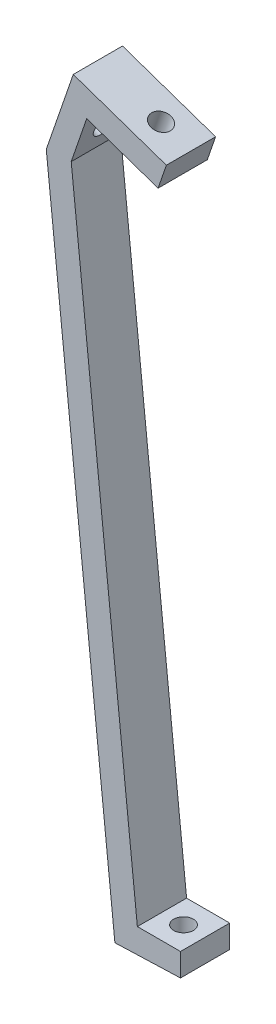
ISO-10303-21;
HEADER;
FILE_DESCRIPTION(('STEP AP214'),'2;1');
FILE_NAME('part.step','',(''),(''),'','','');
FILE_SCHEMA(('AUTOMOTIVE_DESIGN { 1 0 10303 214 1 1 1 1 }'));
ENDSEC;
DATA;
#1=APPLICATION_CONTEXT('core data for automotive mechanical design processes');
#2=APPLICATION_PROTOCOL_DEFINITION('international standard','automotive_design',2000,#1);
#3=PRODUCT_CONTEXT('',#1,'mechanical');
#4=PRODUCT('Part','Part','',(#3));
#5=PRODUCT_RELATED_PRODUCT_CATEGORY('part','',(#4));
#6=PRODUCT_DEFINITION_FORMATION('','',#4);
#7=PRODUCT_DEFINITION_CONTEXT('part definition',#1,'design');
#8=PRODUCT_DEFINITION('design','',#6,#7);
#9=PRODUCT_DEFINITION_SHAPE('','',#8);
#10=(LENGTH_UNIT() NAMED_UNIT(*) SI_UNIT(.MILLI.,.METRE.));
#11=(NAMED_UNIT(*) PLANE_ANGLE_UNIT() SI_UNIT($,.RADIAN.));
#12=(NAMED_UNIT(*) SI_UNIT($,.STERADIAN.) SOLID_ANGLE_UNIT());
#13=UNCERTAINTY_MEASURE_WITH_UNIT(LENGTH_MEASURE(1.E-05),#10,'distance_accuracy_value','');
#14=(GEOMETRIC_REPRESENTATION_CONTEXT(3) GLOBAL_UNCERTAINTY_ASSIGNED_CONTEXT((#13)) GLOBAL_UNIT_ASSIGNED_CONTEXT((#10,
#11,#12)) REPRESENTATION_CONTEXT('',''));
#15=CARTESIAN_POINT('',(0.,0.,0.));
#16=DIRECTION('',(0.,0.,1.));
#17=DIRECTION('',(1.,0.,0.));
#18=AXIS2_PLACEMENT_3D('',#15,#16,#17);
#19=CARTESIAN_POINT('',(39.2491732885539,87.5121632175011,3.));
#20=DIRECTION('',(0.945518575599317,-0.325568154457155,0.));
#21=DIRECTION('',(0.325568154457155,0.945518575599317,0.));
#22=AXIS2_PLACEMENT_3D('',#19,#20,#21);
#23=PLANE('',#22);
#24=CARTESIAN_POINT('',(38.3050256406282,84.7701593482631,0.));
#25=DIRECTION('',(0.945518575599317,-0.325568154457155,0.));
#26=DIRECTION('',(0.325568154457155,0.945518575599317,0.));
#27=AXIS2_PLACEMENT_3D('',#24,#25,#26);
#28=CIRCLE('',#27,1.2);
#29=CARTESIAN_POINT('',(38.6957074259767,85.9047816389823,0.));
#30=VERTEX_POINT('',#29);
#31=EDGE_CURVE('E137',#30,#30,#28,.T.);
#32=ORIENTED_EDGE('',*,*,#31,.F.);
#33=EDGE_LOOP('',(#32));
#34=FACE_BOUND('',#33,.T.);
#35=DIRECTION('',(-0.325568154457155,-0.945518575599317,0.));
#36=VECTOR('',#35,1.);
#37=CARTESIAN_POINT('',(39.2491732885539,87.5121632175011,-3.));
#38=LINE('',#37,#36);
#39=CARTESIAN_POINT('',(39.2491732885539,87.5121632175011,-3.));
#40=VERTEX_POINT('',#39);
#41=CARTESIAN_POINT('',(37.3608779927024,82.0281554790251,-3.));
#42=VERTEX_POINT('',#41);
#43=EDGE_CURVE('E134',#40,#42,#38,.T.);
#44=ORIENTED_EDGE('',*,*,#43,.F.);
#45=DIRECTION('',(0.,0.,-1.));
#46=VECTOR('',#45,1.);
#47=CARTESIAN_POINT('',(39.2491732885539,87.5121632175011,3.));
#48=LINE('',#47,#46);
#49=CARTESIAN_POINT('',(39.2491732885539,87.5121632175011,3.));
#50=VERTEX_POINT('',#49);
#51=EDGE_CURVE('E11',#50,#40,#48,.T.);
#52=ORIENTED_EDGE('',*,*,#51,.F.);
#53=DIRECTION('',(-0.325568154457155,-0.945518575599317,0.));
#54=VECTOR('',#53,1.);
#55=CARTESIAN_POINT('',(39.2491732885539,87.5121632175011,3.));
#56=LINE('',#55,#54);
#57=CARTESIAN_POINT('',(37.3608779927024,82.0281554790251,3.));
#58=VERTEX_POINT('',#57);
#59=EDGE_CURVE('E150',#50,#58,#56,.T.);
#60=ORIENTED_EDGE('',*,*,#59,.T.);
#61=DIRECTION('',(0.,0.,-1.));
#62=VECTOR('',#61,1.);
#63=CARTESIAN_POINT('',(37.3608779927024,82.0281554790251,3.));
#64=LINE('',#63,#62);
#65=EDGE_CURVE('E36',#58,#42,#64,.T.);
#66=ORIENTED_EDGE('',*,*,#65,.T.);
#67=EDGE_LOOP('',(#44,#52,#60,#66));
#68=FACE_BOUND('',#67,.T.);
#69=ADVANCED_FACE('F33',(#34,#68),#23,.T.);
#70=CARTESIAN_POINT('',(34.3227441956758,81.8051240207859,3.));
#71=DIRECTION('',(-0.945518575599318,0.325568154457153,0.));
#72=DIRECTION('',(-0.325568154457153,-0.945518575599318,0.));
#73=AXIS2_PLACEMENT_3D('',#70,#71,#72);
#74=PLANE('',#73);
#75=CARTESIAN_POINT('',(35.6575736289501,85.6817501807431,0.));
#76=DIRECTION('',(-0.945518575599318,0.325568154457153,0.));
#77=DIRECTION('',(-0.325568154457153,-0.945518575599318,0.));
#78=AXIS2_PLACEMENT_3D('',#75,#76,#77);
#79=CIRCLE('',#78,1.2);
#80=CARTESIAN_POINT('',(35.2668918436015,84.5471278900239,0.));
#81=VERTEX_POINT('',#80);
#82=EDGE_CURVE('E189',#81,#81,#79,.F.);
#83=ORIENTED_EDGE('',*,*,#82,.T.);
#84=EDGE_LOOP('',(#83));
#85=FACE_BOUND('',#84,.T.);
#86=DIRECTION('',(0.325568154457153,0.945518575599318,0.));
#87=VECTOR('',#86,1.);
#88=CARTESIAN_POINT('',(34.3227441956758,81.8051240207859,-3.));
#89=LINE('',#88,#87);
#90=CARTESIAN_POINT('',(34.3227441956758,81.8051240207859,-3.));
#91=VERTEX_POINT('',#90);
#92=CARTESIAN_POINT('',(37.610982555693,91.354861634339,-3.));
#93=VERTEX_POINT('',#92);
#94=EDGE_CURVE('E148',#91,#93,#89,.T.);
#95=ORIENTED_EDGE('',*,*,#94,.F.);
#96=DIRECTION('',(0.,0.,-1.));
#97=VECTOR('',#96,1.);
#98=CARTESIAN_POINT('',(34.3227441956758,81.8051240207859,3.));
#99=LINE('',#98,#97);
#100=CARTESIAN_POINT('',(34.3227441956758,81.8051240207859,3.));
#101=VERTEX_POINT('',#100);
#102=EDGE_CURVE('E42',#101,#91,#99,.T.);
#103=ORIENTED_EDGE('',*,*,#102,.F.);
#104=DIRECTION('',(0.325568154457153,0.945518575599318,0.));
#105=VECTOR('',#104,1.);
#106=CARTESIAN_POINT('',(34.3227441956758,81.8051240207859,3.));
#107=LINE('',#106,#105);
#108=CARTESIAN_POINT('',(37.610982555693,91.354861634339,3.));
#109=VERTEX_POINT('',#108);
#110=EDGE_CURVE('E132',#101,#109,#107,.T.);
#111=ORIENTED_EDGE('',*,*,#110,.T.);
#112=DIRECTION('',(0.,0.,1.));
#113=VECTOR('',#112,1.);
#114=CARTESIAN_POINT('',(37.610982555693,91.354861634339,-3.));
#115=LINE('',#114,#113);
#116=EDGE_CURVE('E204',#93,#109,#115,.T.);
#117=ORIENTED_EDGE('',*,*,#116,.F.);
#118=EDGE_LOOP('',(#95,#103,#111,#117));
#119=FACE_BOUND('',#118,.T.);
#120=ADVANCED_FACE('F177',(#85,#119),#74,.T.);
#121=CARTESIAN_POINT('',(34.3227441956758,81.8051240207859,3.));
#122=DIRECTION('',(0.994521895368273,0.104528463267658,0.));
#123=DIRECTION('',(-0.104528463267658,0.994521895368273,0.));
#124=AXIS2_PLACEMENT_3D('',#121,#122,#123);
#125=PLANE('',#124);
#126=DIRECTION('',(0.104528463267658,-0.994521895368273,0.));
#127=VECTOR('',#126,1.);
#128=CARTESIAN_POINT('',(34.3227441956758,81.8051240207859,-3.));
#129=LINE('',#128,#127);
#130=CARTESIAN_POINT('',(42.6850212570884,2.24337239132408,-3.));
#131=VERTEX_POINT('',#130);
#132=EDGE_CURVE('E146',#91,#131,#129,.T.);
#133=ORIENTED_EDGE('',*,*,#132,.T.);
#134=DIRECTION('',(0.,0.,-1.));
#135=VECTOR('',#134,1.);
#136=CARTESIAN_POINT('',(42.6850212570884,2.24337239132408,3.));
#137=LINE('',#136,#135);
#138=CARTESIAN_POINT('',(42.6850212570884,2.24337239132408,3.));
#139=VERTEX_POINT('',#138);
#140=EDGE_CURVE('E119',#139,#131,#137,.T.);
#141=ORIENTED_EDGE('',*,*,#140,.F.);
#142=DIRECTION('',(0.104528463267658,-0.994521895368273,0.));
#143=VECTOR('',#142,1.);
#144=CARTESIAN_POINT('',(34.3227441956758,81.8051240207859,3.));
#145=LINE('',#144,#143);
#146=EDGE_CURVE('E107',#101,#139,#145,.T.);
#147=ORIENTED_EDGE('',*,*,#146,.F.);
#148=ORIENTED_EDGE('',*,*,#102,.T.);
#149=EDGE_LOOP('',(#133,#141,#147,#148));
#150=FACE_BOUND('',#149,.T.);
#151=ADVANCED_FACE('F184',(#150),#125,.F.);
#152=CARTESIAN_POINT('',(42.6850212570884,2.24337239132408,3.));
#153=DIRECTION('',(-0.0348994967025016,0.999390827019096,0.));
#154=DIRECTION('',(-0.999390827019096,-0.0348994967025016,0.));
#155=AXIS2_PLACEMENT_3D('',#152,#153,#154);
#156=PLANE('',#155);
#157=CARTESIAN_POINT('',(48.0515539700871,2.43077584316464,0.));
#158=DIRECTION('',(-0.0348994967025016,0.999390827019096,0.));
#159=DIRECTION('',(0.999390827019096,0.0348994967025016,0.));
#160=AXIS2_PLACEMENT_3D('',#157,#158,#159);
#161=ELLIPSE('',#160,1.20073145315859,1.2);
#162=CARTESIAN_POINT('',(49.2515539700871,2.47268076655473,0.));
#163=VERTEX_POINT('',#162);
#164=EDGE_CURVE('E192',#163,#163,#161,.F.);
#165=ORIENTED_EDGE('',*,*,#164,.F.);
#166=EDGE_LOOP('',(#165));
#167=FACE_BOUND('',#166,.T.);
#168=DIRECTION('',(0.999390827019096,0.0348994967025016,0.));
#169=VECTOR('',#168,1.);
#170=CARTESIAN_POINT('',(42.6850212570884,2.24337239132408,-3.));
#171=LINE('',#170,#169);
#172=CARTESIAN_POINT('',(50.6801478732412,2.52256836494409,-3.));
#173=VERTEX_POINT('',#172);
#174=EDGE_CURVE('E116',#131,#173,#171,.T.);
#175=ORIENTED_EDGE('',*,*,#174,.T.);
#176=DIRECTION('',(0.,0.,-1.));
#177=VECTOR('',#176,1.);
#178=CARTESIAN_POINT('',(50.6801478732412,2.52256836494409,3.));
#179=LINE('',#178,#177);
#180=CARTESIAN_POINT('',(50.6801478732412,2.52256836494409,3.));
#181=VERTEX_POINT('',#180);
#182=EDGE_CURVE('E113',#181,#173,#179,.T.);
#183=ORIENTED_EDGE('',*,*,#182,.F.);
#184=DIRECTION('',(0.999390827019096,0.0348994967025016,0.));
#185=VECTOR('',#184,1.);
#186=CARTESIAN_POINT('',(42.6850212570884,2.24337239132408,3.));
#187=LINE('',#186,#185);
#188=EDGE_CURVE('E99',#139,#181,#187,.T.);
#189=ORIENTED_EDGE('',*,*,#188,.F.);
#190=ORIENTED_EDGE('',*,*,#140,.T.);
#191=EDGE_LOOP('',(#175,#183,#189,#190));
#192=FACE_BOUND('',#191,.T.);
#193=ADVANCED_FACE('F114',(#167,#192),#156,.F.);
#194=CARTESIAN_POINT('',(50.6801478732412,2.52256836494409,3.));
#195=DIRECTION('',(-1.,0.,0.));
#196=DIRECTION('',(0.,0.,1.));
#197=AXIS2_PLACEMENT_3D('',#194,#195,#196);
#198=PLANE('',#197);
#199=DIRECTION('',(0.,1.,0.));
#200=VECTOR('',#199,1.);
#201=CARTESIAN_POINT('',(50.6801478732412,2.52256836494409,-3.));
#202=LINE('',#201,#200);
#203=CARTESIAN_POINT('',(50.6801478732412,5.32256836494409,-3.));
#204=VERTEX_POINT('',#203);
#205=EDGE_CURVE('E143',#173,#204,#202,.T.);
#206=ORIENTED_EDGE('',*,*,#205,.T.);
#207=DIRECTION('',(0.,0.,-1.));
#208=VECTOR('',#207,1.);
#209=CARTESIAN_POINT('',(50.6801478732412,5.32256836494409,3.));
#210=LINE('',#209,#208);
#211=CARTESIAN_POINT('',(50.6801478732412,5.32256836494409,3.));
#212=VERTEX_POINT('',#211);
#213=EDGE_CURVE('E120',#212,#204,#210,.T.);
#214=ORIENTED_EDGE('',*,*,#213,.F.);
#215=DIRECTION('',(0.,1.,0.));
#216=VECTOR('',#215,1.);
#217=CARTESIAN_POINT('',(50.6801478732412,2.52256836494409,3.));
#218=LINE('',#217,#216);
#219=EDGE_CURVE('E104',#181,#212,#218,.T.);
#220=ORIENTED_EDGE('',*,*,#219,.F.);
#221=ORIENTED_EDGE('',*,*,#182,.T.);
#222=EDGE_LOOP('',(#206,#214,#220,#221));
#223=FACE_BOUND('',#222,.T.);
#224=ADVANCED_FACE('F122',(#223),#198,.F.);
#225=CARTESIAN_POINT('',(50.6801478732412,5.32256836494409,3.));
#226=DIRECTION('',(0.,-1.,0.));
#227=DIRECTION('',(0.,0.,-1.));
#228=AXIS2_PLACEMENT_3D('',#225,#226,#227);
#229=PLANE('',#228);
#230=CARTESIAN_POINT('',(48.0515539700871,5.3225683649441,0.));
#231=DIRECTION('',(0.,1.,0.));
#232=DIRECTION('',(-1.,0.,0.));
#233=AXIS2_PLACEMENT_3D('',#230,#231,#232);
#234=CIRCLE('',#233,1.2);
#235=CARTESIAN_POINT('',(46.8515539700871,5.3225683649441,0.));
#236=VERTEX_POINT('',#235);
#237=EDGE_CURVE('E212',#236,#236,#234,.T.);
#238=ORIENTED_EDGE('',*,*,#237,.F.);
#239=EDGE_LOOP('',(#238));
#240=FACE_BOUND('',#239,.T.);
#241=DIRECTION('',(-1.,0.,0.));
#242=VECTOR('',#241,1.);
#243=CARTESIAN_POINT('',(50.6801478732412,5.32256836494409,-3.));
#244=LINE('',#243,#242);
#245=CARTESIAN_POINT('',(45.422960066933,5.32256836494409,-3.));
#246=VERTEX_POINT('',#245);
#247=EDGE_CURVE('E140',#204,#246,#244,.T.);
#248=ORIENTED_EDGE('',*,*,#247,.T.);
#249=DIRECTION('',(0.,0.,-1.));
#250=VECTOR('',#249,1.);
#251=CARTESIAN_POINT('',(45.422960066933,5.32256836494409,3.));
#252=LINE('',#251,#250);
#253=CARTESIAN_POINT('',(45.422960066933,5.32256836494409,3.));
#254=VERTEX_POINT('',#253);
#255=EDGE_CURVE('E154',#254,#246,#252,.T.);
#256=ORIENTED_EDGE('',*,*,#255,.F.);
#257=DIRECTION('',(-1.,0.,0.));
#258=VECTOR('',#257,1.);
#259=CARTESIAN_POINT('',(50.6801478732412,5.32256836494409,3.));
#260=LINE('',#259,#258);
#261=EDGE_CURVE('E125',#212,#254,#260,.T.);
#262=ORIENTED_EDGE('',*,*,#261,.F.);
#263=ORIENTED_EDGE('',*,*,#213,.T.);
#264=EDGE_LOOP('',(#248,#256,#262,#263));
#265=FACE_BOUND('',#264,.T.);
#266=ADVANCED_FACE('F199',(#240,#265),#229,.F.);
#267=CARTESIAN_POINT('',(37.3608779927024,82.0281554790251,3.));
#268=DIRECTION('',(0.994521895368273,0.104528463267658,0.));
#269=DIRECTION('',(-0.104528463267658,0.994521895368273,0.));
#270=AXIS2_PLACEMENT_3D('',#267,#268,#269);
#271=PLANE('',#270);
#272=DIRECTION('',(0.104528463267658,-0.994521895368273,0.));
#273=VECTOR('',#272,1.);
#274=CARTESIAN_POINT('',(37.3608779927024,82.0281554790251,-3.));
#275=LINE('',#274,#273);
#276=EDGE_CURVE('E136',#42,#246,#275,.T.);
#277=ORIENTED_EDGE('',*,*,#276,.F.);
#278=ORIENTED_EDGE('',*,*,#65,.F.);
#279=DIRECTION('',(0.104528463267658,-0.994521895368273,0.));
#280=VECTOR('',#279,1.);
#281=CARTESIAN_POINT('',(37.3608779927024,82.0281554790251,3.));
#282=LINE('',#281,#280);
#283=EDGE_CURVE('E127',#58,#254,#282,.T.);
#284=ORIENTED_EDGE('',*,*,#283,.T.);
#285=ORIENTED_EDGE('',*,*,#255,.T.);
#286=EDGE_LOOP('',(#277,#278,#284,#285));
#287=FACE_BOUND('',#286,.T.);
#288=ADVANCED_FACE('F160',(#287),#271,.T.);
#289=CARTESIAN_POINT('',(0.,0.,3.));
#290=DIRECTION('',(0.,0.,1.));
#291=DIRECTION('',(1.,0.,0.));
#292=AXIS2_PLACEMENT_3D('',#289,#290,#291);
#293=PLANE('',#292);
#294=ORIENTED_EDGE('',*,*,#59,.F.);
#295=DIRECTION('',(0.945518575599318,-0.325568154457154,0.));
#296=VECTOR('',#295,1.);
#297=CARTESIAN_POINT('',(47.9479441840676,84.5169361964953,3.));
#298=LINE('',#297,#296);
#299=CARTESIAN_POINT('',(47.9479441840676,84.5169361964953,3.));
#300=VERTEX_POINT('',#299);
#301=EDGE_CURVE('E228',#50,#300,#298,.T.);
#302=ORIENTED_EDGE('',*,*,#301,.T.);
#303=DIRECTION('',(0.325568154457152,0.945518575599318,0.));
#304=VECTOR('',#303,1.);
#305=CARTESIAN_POINT('',(48.9572054628848,87.4480437808532,3.));
#306=LINE('',#305,#304);
#307=CARTESIAN_POINT('',(48.9572054628848,87.4480437808532,3.));
#308=VERTEX_POINT('',#307);
#309=EDGE_CURVE('E230',#300,#308,#306,.T.);
#310=ORIENTED_EDGE('',*,*,#309,.T.);
#311=DIRECTION('',(-0.945518575599318,0.325568154457153,0.));
#312=VECTOR('',#311,1.);
#313=CARTESIAN_POINT('',(37.610982555693,91.354861634339,3.));
#314=LINE('',#313,#312);
#315=EDGE_CURVE('E234',#308,#109,#314,.T.);
#316=ORIENTED_EDGE('',*,*,#315,.T.);
#317=ORIENTED_EDGE('',*,*,#110,.F.);
#318=ORIENTED_EDGE('',*,*,#146,.T.);
#319=ORIENTED_EDGE('',*,*,#188,.T.);
#320=ORIENTED_EDGE('',*,*,#219,.T.);
#321=ORIENTED_EDGE('',*,*,#261,.T.);
#322=ORIENTED_EDGE('',*,*,#283,.F.);
#323=EDGE_LOOP('',(#294,#302,#310,#316,#317,#318,#319,#320,#321,#322));
#324=FACE_BOUND('',#323,.T.);
#325=ADVANCED_FACE('F102',(#324),#293,.T.);
#326=CARTESIAN_POINT('',(0.,0.,-3.));
#327=DIRECTION('',(0.,0.,1.));
#328=DIRECTION('',(1.,0.,0.));
#329=AXIS2_PLACEMENT_3D('',#326,#327,#328);
#330=PLANE('',#329);
#331=ORIENTED_EDGE('',*,*,#43,.T.);
#332=ORIENTED_EDGE('',*,*,#276,.T.);
#333=ORIENTED_EDGE('',*,*,#247,.F.);
#334=ORIENTED_EDGE('',*,*,#205,.F.);
#335=ORIENTED_EDGE('',*,*,#174,.F.);
#336=ORIENTED_EDGE('',*,*,#132,.F.);
#337=ORIENTED_EDGE('',*,*,#94,.T.);
#338=DIRECTION('',(-0.945518575599318,0.325568154457153,0.));
#339=VECTOR('',#338,1.);
#340=CARTESIAN_POINT('',(37.610982555693,91.354861634339,-3.));
#341=LINE('',#340,#339);
#342=CARTESIAN_POINT('',(48.9572054628848,87.4480437808532,-3.));
#343=VERTEX_POINT('',#342);
#344=EDGE_CURVE('E216',#343,#93,#341,.T.);
#345=ORIENTED_EDGE('',*,*,#344,.F.);
#346=DIRECTION('',(0.325568154457152,0.945518575599318,0.));
#347=VECTOR('',#346,1.);
#348=CARTESIAN_POINT('',(48.9572054628848,87.4480437808532,-3.));
#349=LINE('',#348,#347);
#350=CARTESIAN_POINT('',(47.9479441840676,84.5169361964953,-3.));
#351=VERTEX_POINT('',#350);
#352=EDGE_CURVE('E221',#351,#343,#349,.T.);
#353=ORIENTED_EDGE('',*,*,#352,.F.);
#354=DIRECTION('',(0.945518575599318,-0.325568154457154,0.));
#355=VECTOR('',#354,1.);
#356=CARTESIAN_POINT('',(47.9479441840676,84.5169361964953,-3.));
#357=LINE('',#356,#355);
#358=EDGE_CURVE('E81',#40,#351,#357,.T.);
#359=ORIENTED_EDGE('',*,*,#358,.F.);
#360=EDGE_LOOP('',(#331,#332,#333,#334,#335,#336,#337,#345,#353,#359));
#361=FACE_BOUND('',#360,.T.);
#362=ADVANCED_FACE('F162',(#361),#330,.F.);
#363=CARTESIAN_POINT('',(33.6189540286311,86.3837032021265,0.));
#364=DIRECTION('',(0.945518575599317,-0.325568154457155,0.));
#365=DIRECTION('',(0.325568154457155,0.945518575599317,0.));
#366=AXIS2_PLACEMENT_3D('',#363,#364,#365);
#367=CYLINDRICAL_SURFACE('',#366,1.2);
#368=ORIENTED_EDGE('',*,*,#82,.F.);
#369=EDGE_LOOP('',(#368));
#370=FACE_BOUND('',#369,.T.);
#371=ORIENTED_EDGE('',*,*,#31,.T.);
#372=EDGE_LOOP('',(#371));
#373=FACE_BOUND('',#372,.T.);
#374=ADVANCED_FACE('F164',(#370,#373),#367,.F.);
#375=CARTESIAN_POINT('',(48.0515539700871,2.24237239132408,0.));
#376=DIRECTION('',(0.,1.,0.));
#377=DIRECTION('',(-1.,0.,0.));
#378=AXIS2_PLACEMENT_3D('',#375,#376,#377);
#379=CYLINDRICAL_SURFACE('',#378,1.2);
#380=ORIENTED_EDGE('',*,*,#237,.T.);
#381=EDGE_LOOP('',(#380));
#382=FACE_BOUND('',#381,.T.);
#383=ORIENTED_EDGE('',*,*,#164,.T.);
#384=EDGE_LOOP('',(#383));
#385=FACE_BOUND('',#384,.T.);
#386=ADVANCED_FACE('F171',(#382,#385),#379,.F.);
#387=CARTESIAN_POINT('',(47.9479441840676,84.5169361964953,-3.));
#388=DIRECTION('',(-0.325568154457154,-0.945518575599318,0.));
#389=DIRECTION('',(0.945518575599318,-0.325568154457154,0.));
#390=AXIS2_PLACEMENT_3D('',#387,#388,#389);
#391=PLANE('',#390);
#392=CARTESIAN_POINT('',(44.2982424822543,85.7736292726999,0.));
#393=DIRECTION('',(-0.325568154457154,-0.945518575599318,0.));
#394=DIRECTION('',(0.945518575599318,-0.325568154457154,0.));
#395=AXIS2_PLACEMENT_3D('',#392,#393,#394);
#396=CIRCLE('',#395,1.2);
#397=CARTESIAN_POINT('',(45.4328647729735,85.3829474873513,0.));
#398=VERTEX_POINT('',#397);
#399=EDGE_CURVE('E323',#398,#398,#396,.F.);
#400=ORIENTED_EDGE('',*,*,#399,.T.);
#401=EDGE_LOOP('',(#400));
#402=FACE_BOUND('',#401,.T.);
#403=ORIENTED_EDGE('',*,*,#301,.F.);
#404=ORIENTED_EDGE('',*,*,#51,.T.);
#405=ORIENTED_EDGE('',*,*,#358,.T.);
#406=DIRECTION('',(0.,0.,1.));
#407=VECTOR('',#406,1.);
#408=CARTESIAN_POINT('',(47.9479441840676,84.5169361964953,-3.));
#409=LINE('',#408,#407);
#410=EDGE_CURVE('E220',#351,#300,#409,.T.);
#411=ORIENTED_EDGE('',*,*,#410,.T.);
#412=EDGE_LOOP('',(#403,#404,#405,#411));
#413=FACE_BOUND('',#412,.T.);
#414=ADVANCED_FACE('F268',(#402,#413),#391,.T.);
#415=CARTESIAN_POINT('',(37.610982555693,91.354861634339,-3.));
#416=DIRECTION('',(0.325568154457153,0.945518575599318,0.));
#417=DIRECTION('',(-0.945518575599318,0.325568154457153,0.));
#418=AXIS2_PLACEMENT_3D('',#415,#416,#417);
#419=PLANE('',#418);
#420=CARTESIAN_POINT('',(45.3075037610715,88.7047368570578,0.));
#421=DIRECTION('',(0.325568154457153,0.945518575599318,0.));
#422=DIRECTION('',(-0.945518575599318,0.325568154457153,0.));
#423=AXIS2_PLACEMENT_3D('',#420,#421,#422);
#424=CIRCLE('',#423,1.2);
#425=CARTESIAN_POINT('',(44.1728814703523,89.0954186424064,0.));
#426=VERTEX_POINT('',#425);
#427=EDGE_CURVE('E231',#426,#426,#424,.T.);
#428=ORIENTED_EDGE('',*,*,#427,.F.);
#429=EDGE_LOOP('',(#428));
#430=FACE_BOUND('',#429,.T.);
#431=ORIENTED_EDGE('',*,*,#315,.F.);
#432=DIRECTION('',(0.,0.,1.));
#433=VECTOR('',#432,1.);
#434=CARTESIAN_POINT('',(48.9572054628848,87.4480437808532,-3.));
#435=LINE('',#434,#433);
#436=EDGE_CURVE('E213',#343,#308,#435,.T.);
#437=ORIENTED_EDGE('',*,*,#436,.F.);
#438=ORIENTED_EDGE('',*,*,#344,.T.);
#439=ORIENTED_EDGE('',*,*,#116,.T.);
#440=EDGE_LOOP('',(#431,#437,#438,#439));
#441=FACE_BOUND('',#440,.T.);
#442=ADVANCED_FACE('F217',(#430,#441),#419,.T.);
#443=CARTESIAN_POINT('',(48.9572054628848,87.4480437808532,-3.));
#444=DIRECTION('',(0.945518575599318,-0.325568154457152,0.));
#445=DIRECTION('',(0.325568154457152,0.945518575599318,0.));
#446=AXIS2_PLACEMENT_3D('',#443,#444,#445);
#447=PLANE('',#446);
#448=ORIENTED_EDGE('',*,*,#309,.F.);
#449=ORIENTED_EDGE('',*,*,#410,.F.);
#450=ORIENTED_EDGE('',*,*,#352,.T.);
#451=ORIENTED_EDGE('',*,*,#436,.T.);
#452=EDGE_LOOP('',(#448,#449,#450,#451));
#453=FACE_BOUND('',#452,.T.);
#454=ADVANCED_FACE('F289',(#453),#447,.T.);
#455=CARTESIAN_POINT('',(17.5272988818496,8.02516366275755,0.));
#456=DIRECTION('',(0.325568154457153,0.945518575599318,0.));
#457=DIRECTION('',(-0.945518575599318,0.325568154457153,0.));
#458=AXIS2_PLACEMENT_3D('',#455,#456,#457);
#459=CYLINDRICAL_SURFACE('',#458,1.2);
#460=ORIENTED_EDGE('',*,*,#399,.F.);
#461=EDGE_LOOP('',(#460));
#462=FACE_BOUND('',#461,.T.);
#463=ORIENTED_EDGE('',*,*,#427,.T.);
#464=EDGE_LOOP('',(#463));
#465=FACE_BOUND('',#464,.T.);
#466=ADVANCED_FACE('F294',(#462,#465),#459,.F.);
#467=CLOSED_SHELL('',(#69,#120,#151,#193,#224,#266,#288,#325,#362,#374,#386,#414,#442,#454,#466));
#468=MANIFOLD_SOLID_BREP('B2',#467);
#469=ADVANCED_BREP_SHAPE_REPRESENTATION('',(#18,#468),#14);
#470=SHAPE_DEFINITION_REPRESENTATION(#9,#469);
ENDSEC;
END-ISO-10303-21;
